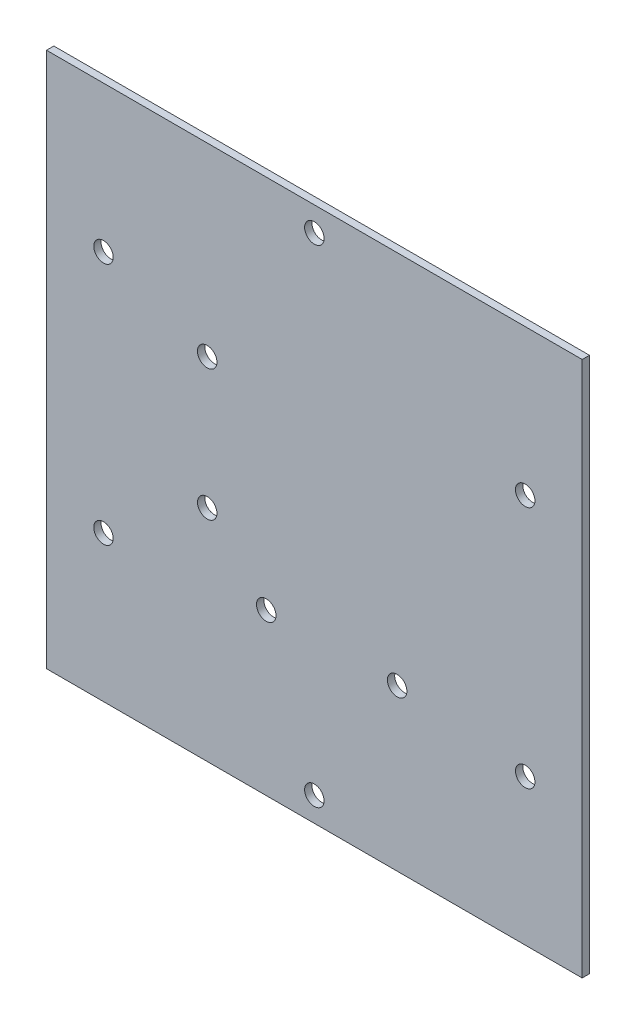
ISO-10303-21;
HEADER;
FILE_DESCRIPTION(('STEP AP214'),'2;1');
FILE_NAME('part.step','',(''),(''),'','','');
FILE_SCHEMA(('AUTOMOTIVE_DESIGN { 1 0 10303 214 1 1 1 1 }'));
ENDSEC;
DATA;
#1=APPLICATION_CONTEXT('core data for automotive mechanical design processes');
#2=APPLICATION_PROTOCOL_DEFINITION('international standard','automotive_design',2000,#1);
#3=PRODUCT_CONTEXT('',#1,'mechanical');
#4=PRODUCT('Part','Part','',(#3));
#5=PRODUCT_RELATED_PRODUCT_CATEGORY('part','',(#4));
#6=PRODUCT_DEFINITION_FORMATION('','',#4);
#7=PRODUCT_DEFINITION_CONTEXT('part definition',#1,'design');
#8=PRODUCT_DEFINITION('design','',#6,#7);
#9=PRODUCT_DEFINITION_SHAPE('','',#8);
#10=(LENGTH_UNIT() NAMED_UNIT(*) SI_UNIT(.MILLI.,.METRE.));
#11=(NAMED_UNIT(*) PLANE_ANGLE_UNIT() SI_UNIT($,.RADIAN.));
#12=(NAMED_UNIT(*) SI_UNIT($,.STERADIAN.) SOLID_ANGLE_UNIT());
#13=UNCERTAINTY_MEASURE_WITH_UNIT(LENGTH_MEASURE(1.E-05),#10,'distance_accuracy_value','');
#14=(GEOMETRIC_REPRESENTATION_CONTEXT(3) GLOBAL_UNCERTAINTY_ASSIGNED_CONTEXT((#13)) GLOBAL_UNIT_ASSIGNED_CONTEXT((#10,
#11,#12)) REPRESENTATION_CONTEXT('',''));
#15=CARTESIAN_POINT('',(0.,0.,0.));
#16=DIRECTION('',(0.,0.,1.));
#17=DIRECTION('',(1.,0.,0.));
#18=AXIS2_PLACEMENT_3D('',#15,#16,#17);
#19=CARTESIAN_POINT('',(-110.,110.,-3.));
#20=DIRECTION('',(-1.,0.,0.));
#21=DIRECTION('',(0.,0.,1.));
#22=AXIS2_PLACEMENT_3D('',#19,#20,#21);
#23=PLANE('',#22);
#24=DIRECTION('',(0.,-1.,0.));
#25=VECTOR('',#24,1.);
#26=CARTESIAN_POINT('',(-110.,110.,0.));
#27=LINE('',#26,#25);
#28=CARTESIAN_POINT('',(-110.,110.,0.));
#29=VERTEX_POINT('',#28);
#30=CARTESIAN_POINT('',(-110.,-110.,0.));
#31=VERTEX_POINT('',#30);
#32=EDGE_CURVE('E102',#29,#31,#27,.T.);
#33=ORIENTED_EDGE('',*,*,#32,.F.);
#34=DIRECTION('',(0.,0.,1.));
#35=VECTOR('',#34,1.);
#36=CARTESIAN_POINT('',(-110.,110.,-3.));
#37=LINE('',#36,#35);
#38=CARTESIAN_POINT('',(-110.,110.,-3.));
#39=VERTEX_POINT('',#38);
#40=EDGE_CURVE('E11',#39,#29,#37,.T.);
#41=ORIENTED_EDGE('',*,*,#40,.F.);
#42=DIRECTION('',(0.,-1.,0.));
#43=VECTOR('',#42,1.);
#44=CARTESIAN_POINT('',(-110.,110.,-3.));
#45=LINE('',#44,#43);
#46=CARTESIAN_POINT('',(-110.,-110.,-3.));
#47=VERTEX_POINT('',#46);
#48=EDGE_CURVE('E95',#39,#47,#45,.T.);
#49=ORIENTED_EDGE('',*,*,#48,.T.);
#50=DIRECTION('',(0.,0.,1.));
#51=VECTOR('',#50,1.);
#52=CARTESIAN_POINT('',(-110.,-110.,-3.));
#53=LINE('',#52,#51);
#54=EDGE_CURVE('E40',#47,#31,#53,.T.);
#55=ORIENTED_EDGE('',*,*,#54,.T.);
#56=EDGE_LOOP('',(#33,#41,#49,#55));
#57=FACE_BOUND('',#56,.T.);
#58=ADVANCED_FACE('F37',(#57),#23,.T.);
#59=CARTESIAN_POINT('',(-110.,110.,-3.));
#60=DIRECTION('',(0.,1.,0.));
#61=DIRECTION('',(0.,0.,1.));
#62=AXIS2_PLACEMENT_3D('',#59,#60,#61);
#63=PLANE('',#62);
#64=DIRECTION('',(-1.,0.,0.));
#65=VECTOR('',#64,1.);
#66=CARTESIAN_POINT('',(-110.,110.,0.));
#67=LINE('',#66,#65);
#68=CARTESIAN_POINT('',(110.,110.,0.));
#69=VERTEX_POINT('',#68);
#70=EDGE_CURVE('E97',#69,#29,#67,.T.);
#71=ORIENTED_EDGE('',*,*,#70,.F.);
#72=DIRECTION('',(0.,0.,1.));
#73=VECTOR('',#72,1.);
#74=CARTESIAN_POINT('',(110.,110.,-3.));
#75=LINE('',#74,#73);
#76=CARTESIAN_POINT('',(110.,110.,-3.));
#77=VERTEX_POINT('',#76);
#78=EDGE_CURVE('E46',#77,#69,#75,.T.);
#79=ORIENTED_EDGE('',*,*,#78,.F.);
#80=DIRECTION('',(-1.,0.,0.));
#81=VECTOR('',#80,1.);
#82=CARTESIAN_POINT('',(-110.,110.,-3.));
#83=LINE('',#82,#81);
#84=EDGE_CURVE('E92',#77,#39,#83,.T.);
#85=ORIENTED_EDGE('',*,*,#84,.T.);
#86=ORIENTED_EDGE('',*,*,#40,.T.);
#87=EDGE_LOOP('',(#71,#79,#85,#86));
#88=FACE_BOUND('',#87,.T.);
#89=ADVANCED_FACE('F113',(#88),#63,.T.);
#90=CARTESIAN_POINT('',(110.,110.,-3.));
#91=DIRECTION('',(1.,0.,0.));
#92=DIRECTION('',(0.,0.,-1.));
#93=AXIS2_PLACEMENT_3D('',#90,#91,#92);
#94=PLANE('',#93);
#95=DIRECTION('',(0.,1.,0.));
#96=VECTOR('',#95,1.);
#97=CARTESIAN_POINT('',(110.,110.,0.));
#98=LINE('',#97,#96);
#99=CARTESIAN_POINT('',(110.,-110.,0.));
#100=VERTEX_POINT('',#99);
#101=EDGE_CURVE('E87',#100,#69,#98,.T.);
#102=ORIENTED_EDGE('',*,*,#101,.F.);
#103=DIRECTION('',(0.,0.,1.));
#104=VECTOR('',#103,1.);
#105=CARTESIAN_POINT('',(110.,-110.,-3.));
#106=LINE('',#105,#104);
#107=CARTESIAN_POINT('',(110.,-110.,-3.));
#108=VERTEX_POINT('',#107);
#109=EDGE_CURVE('E82',#108,#100,#106,.T.);
#110=ORIENTED_EDGE('',*,*,#109,.F.);
#111=DIRECTION('',(0.,1.,0.));
#112=VECTOR('',#111,1.);
#113=CARTESIAN_POINT('',(110.,110.,-3.));
#114=LINE('',#113,#112);
#115=EDGE_CURVE('E85',#108,#77,#114,.T.);
#116=ORIENTED_EDGE('',*,*,#115,.T.);
#117=ORIENTED_EDGE('',*,*,#78,.T.);
#118=EDGE_LOOP('',(#102,#110,#116,#117));
#119=FACE_BOUND('',#118,.T.);
#120=ADVANCED_FACE('F84',(#119),#94,.T.);
#121=CARTESIAN_POINT('',(-110.,-110.,-3.));
#122=DIRECTION('',(0.,-1.,0.));
#123=DIRECTION('',(0.,0.,-1.));
#124=AXIS2_PLACEMENT_3D('',#121,#122,#123);
#125=PLANE('',#124);
#126=DIRECTION('',(1.,0.,0.));
#127=VECTOR('',#126,1.);
#128=CARTESIAN_POINT('',(-110.,-110.,0.));
#129=LINE('',#128,#127);
#130=EDGE_CURVE('E105',#31,#100,#129,.T.);
#131=ORIENTED_EDGE('',*,*,#130,.F.);
#132=ORIENTED_EDGE('',*,*,#54,.F.);
#133=DIRECTION('',(1.,0.,0.));
#134=VECTOR('',#133,1.);
#135=CARTESIAN_POINT('',(-110.,-110.,-3.));
#136=LINE('',#135,#134);
#137=EDGE_CURVE('E91',#47,#108,#136,.T.);
#138=ORIENTED_EDGE('',*,*,#137,.T.);
#139=ORIENTED_EDGE('',*,*,#109,.T.);
#140=EDGE_LOOP('',(#131,#132,#138,#139));
#141=FACE_BOUND('',#140,.T.);
#142=ADVANCED_FACE('F94',(#141),#125,.T.);
#143=CARTESIAN_POINT('',(0.,0.,-3.));
#144=DIRECTION('',(0.,0.,1.));
#145=DIRECTION('',(1.,0.,0.));
#146=AXIS2_PLACEMENT_3D('',#143,#144,#145);
#147=PLANE('',#146);
#148=CARTESIAN_POINT('',(-44.,34.,-3.));
#149=DIRECTION('',(0.,0.,1.));
#150=DIRECTION('',(1.,0.,0.));
#151=AXIS2_PLACEMENT_3D('',#148,#149,#150);
#152=CIRCLE('',#151,4.00000000000001);
#153=CARTESIAN_POINT('',(-40.,34.,-3.));
#154=VERTEX_POINT('',#153);
#155=EDGE_CURVE('E188',#154,#154,#152,.T.);
#156=ORIENTED_EDGE('',*,*,#155,.T.);
#157=EDGE_LOOP('',(#156));
#158=FACE_BOUND('',#157,.T.);
#159=CARTESIAN_POINT('',(34.,-44.,-3.));
#160=DIRECTION('',(0.,0.,1.));
#161=DIRECTION('',(1.,0.,0.));
#162=AXIS2_PLACEMENT_3D('',#159,#160,#161);
#163=CIRCLE('',#162,4.00000000000001);
#164=CARTESIAN_POINT('',(38.,-44.,-3.));
#165=VERTEX_POINT('',#164);
#166=EDGE_CURVE('E194',#165,#165,#163,.T.);
#167=ORIENTED_EDGE('',*,*,#166,.T.);
#168=EDGE_LOOP('',(#167));
#169=FACE_BOUND('',#168,.T.);
#170=CARTESIAN_POINT('',(-44.,-19.75,-3.));
#171=DIRECTION('',(0.,0.,1.));
#172=DIRECTION('',(1.,0.,0.));
#173=AXIS2_PLACEMENT_3D('',#170,#171,#172);
#174=CIRCLE('',#173,4.00000000000001);
#175=CARTESIAN_POINT('',(-40.,-19.75,-3.));
#176=VERTEX_POINT('',#175);
#177=EDGE_CURVE('E179',#176,#176,#174,.T.);
#178=ORIENTED_EDGE('',*,*,#177,.T.);
#179=EDGE_LOOP('',(#178));
#180=FACE_BOUND('',#179,.T.);
#181=CARTESIAN_POINT('',(-19.75,-44.,-3.));
#182=DIRECTION('',(0.,0.,1.));
#183=DIRECTION('',(1.,0.,0.));
#184=AXIS2_PLACEMENT_3D('',#181,#182,#183);
#185=CIRCLE('',#184,4.);
#186=CARTESIAN_POINT('',(-15.75,-44.,-3.));
#187=VERTEX_POINT('',#186);
#188=EDGE_CURVE('E199',#187,#187,#185,.T.);
#189=ORIENTED_EDGE('',*,*,#188,.T.);
#190=EDGE_LOOP('',(#189));
#191=FACE_BOUND('',#190,.T.);
#192=CARTESIAN_POINT('',(-86.6025403784439,50.,-3.));
#193=DIRECTION('',(0.,0.,1.));
#194=DIRECTION('',(1.,0.,0.));
#195=AXIS2_PLACEMENT_3D('',#192,#193,#194);
#196=CIRCLE('',#195,4.00000000000118);
#197=CARTESIAN_POINT('',(-82.6025403784428,50.,-3.));
#198=VERTEX_POINT('',#197);
#199=EDGE_CURVE('E205',#198,#198,#196,.T.);
#200=ORIENTED_EDGE('',*,*,#199,.T.);
#201=EDGE_LOOP('',(#200));
#202=FACE_BOUND('',#201,.T.);
#203=CARTESIAN_POINT('',(-86.6025403784443,-49.9999999999992,-3.));
#204=DIRECTION('',(0.,0.,1.));
#205=DIRECTION('',(1.,0.,0.));
#206=AXIS2_PLACEMENT_3D('',#203,#204,#205);
#207=CIRCLE('',#206,4.);
#208=CARTESIAN_POINT('',(-82.6025403784443,-49.9999999999992,-3.));
#209=VERTEX_POINT('',#208);
#210=EDGE_CURVE('E211',#209,#209,#207,.T.);
#211=ORIENTED_EDGE('',*,*,#210,.T.);
#212=EDGE_LOOP('',(#211));
#213=FACE_BOUND('',#212,.T.);
#214=CARTESIAN_POINT('',(-6.91357373864719E-13,-100.,-3.));
#215=DIRECTION('',(0.,0.,1.));
#216=DIRECTION('',(1.,0.,0.));
#217=AXIS2_PLACEMENT_3D('',#214,#215,#216);
#218=CIRCLE('',#217,4.00000000000001);
#219=CARTESIAN_POINT('',(3.99999999999932,-100.,-3.));
#220=VERTEX_POINT('',#219);
#221=EDGE_CURVE('E217',#220,#220,#218,.T.);
#222=ORIENTED_EDGE('',*,*,#221,.T.);
#223=EDGE_LOOP('',(#222));
#224=FACE_BOUND('',#223,.T.);
#225=CARTESIAN_POINT('',(86.6025403784436,-50.0000000000004,-3.));
#226=DIRECTION('',(0.,0.,1.));
#227=DIRECTION('',(1.,0.,0.));
#228=AXIS2_PLACEMENT_3D('',#225,#226,#227);
#229=CIRCLE('',#228,4.00000000000001);
#230=CARTESIAN_POINT('',(90.6025403784436,-50.0000000000004,-3.));
#231=VERTEX_POINT('',#230);
#232=EDGE_CURVE('E223',#231,#231,#229,.T.);
#233=ORIENTED_EDGE('',*,*,#232,.T.);
#234=EDGE_LOOP('',(#233));
#235=FACE_BOUND('',#234,.T.);
#236=CARTESIAN_POINT('',(86.6025403784439,50.,-3.));
#237=DIRECTION('',(0.,0.,1.));
#238=DIRECTION('',(1.,0.,0.));
#239=AXIS2_PLACEMENT_3D('',#236,#237,#238);
#240=CIRCLE('',#239,4.00000000000025);
#241=CARTESIAN_POINT('',(90.6025403784441,50.,-3.));
#242=VERTEX_POINT('',#241);
#243=EDGE_CURVE('E229',#242,#242,#240,.T.);
#244=ORIENTED_EDGE('',*,*,#243,.T.);
#245=EDGE_LOOP('',(#244));
#246=FACE_BOUND('',#245,.T.);
#247=CARTESIAN_POINT('',(0.,100.,-3.));
#248=DIRECTION('',(0.,0.,1.));
#249=DIRECTION('',(1.,0.,0.));
#250=AXIS2_PLACEMENT_3D('',#247,#248,#249);
#251=CIRCLE('',#250,3.99999999999999);
#252=CARTESIAN_POINT('',(3.99999999999999,100.,-3.));
#253=VERTEX_POINT('',#252);
#254=EDGE_CURVE('E106',#253,#253,#251,.T.);
#255=ORIENTED_EDGE('',*,*,#254,.T.);
#256=EDGE_LOOP('',(#255));
#257=FACE_BOUND('',#256,.T.);
#258=ORIENTED_EDGE('',*,*,#48,.F.);
#259=ORIENTED_EDGE('',*,*,#84,.F.);
#260=ORIENTED_EDGE('',*,*,#115,.F.);
#261=ORIENTED_EDGE('',*,*,#137,.F.);
#262=EDGE_LOOP('',(#258,#259,#260,#261));
#263=FACE_BOUND('',#262,.T.);
#264=ADVANCED_FACE('F90',(#158,#169,#180,#191,#202,#213,#224,#235,#246,#257,#263),#147,.F.);
#265=CARTESIAN_POINT('',(0.,0.,0.));
#266=DIRECTION('',(0.,0.,1.));
#267=DIRECTION('',(1.,0.,0.));
#268=AXIS2_PLACEMENT_3D('',#265,#266,#267);
#269=PLANE('',#268);
#270=CARTESIAN_POINT('',(-44.,34.,0.));
#271=DIRECTION('',(0.,0.,1.));
#272=DIRECTION('',(1.,0.,0.));
#273=AXIS2_PLACEMENT_3D('',#270,#271,#272);
#274=CIRCLE('',#273,4.00000000000001);
#275=CARTESIAN_POINT('',(-40.,34.,0.));
#276=VERTEX_POINT('',#275);
#277=EDGE_CURVE('E191',#276,#276,#274,.T.);
#278=ORIENTED_EDGE('',*,*,#277,.F.);
#279=EDGE_LOOP('',(#278));
#280=FACE_BOUND('',#279,.T.);
#281=CARTESIAN_POINT('',(34.,-44.,0.));
#282=DIRECTION('',(0.,0.,1.));
#283=DIRECTION('',(1.,0.,0.));
#284=AXIS2_PLACEMENT_3D('',#281,#282,#283);
#285=CIRCLE('',#284,4.00000000000001);
#286=CARTESIAN_POINT('',(38.,-44.,0.));
#287=VERTEX_POINT('',#286);
#288=EDGE_CURVE('E185',#287,#287,#285,.T.);
#289=ORIENTED_EDGE('',*,*,#288,.F.);
#290=EDGE_LOOP('',(#289));
#291=FACE_BOUND('',#290,.T.);
#292=CARTESIAN_POINT('',(-44.,-19.75,0.));
#293=DIRECTION('',(0.,0.,1.));
#294=DIRECTION('',(1.,0.,0.));
#295=AXIS2_PLACEMENT_3D('',#292,#293,#294);
#296=CIRCLE('',#295,4.00000000000001);
#297=CARTESIAN_POINT('',(-40.,-19.75,0.));
#298=VERTEX_POINT('',#297);
#299=EDGE_CURVE('E182',#298,#298,#296,.T.);
#300=ORIENTED_EDGE('',*,*,#299,.F.);
#301=EDGE_LOOP('',(#300));
#302=FACE_BOUND('',#301,.T.);
#303=CARTESIAN_POINT('',(-19.75,-44.,0.));
#304=DIRECTION('',(0.,0.,1.));
#305=DIRECTION('',(1.,0.,0.));
#306=AXIS2_PLACEMENT_3D('',#303,#304,#305);
#307=CIRCLE('',#306,4.);
#308=CARTESIAN_POINT('',(-15.75,-44.,0.));
#309=VERTEX_POINT('',#308);
#310=EDGE_CURVE('E190',#309,#309,#307,.T.);
#311=ORIENTED_EDGE('',*,*,#310,.F.);
#312=EDGE_LOOP('',(#311));
#313=FACE_BOUND('',#312,.T.);
#314=CARTESIAN_POINT('',(-86.6025403784439,50.,0.));
#315=DIRECTION('',(0.,0.,1.));
#316=DIRECTION('',(1.,0.,0.));
#317=AXIS2_PLACEMENT_3D('',#314,#315,#316);
#318=CIRCLE('',#317,4.00000000000118);
#319=CARTESIAN_POINT('',(-82.6025403784428,50.,0.));
#320=VERTEX_POINT('',#319);
#321=EDGE_CURVE('E202',#320,#320,#318,.T.);
#322=ORIENTED_EDGE('',*,*,#321,.F.);
#323=EDGE_LOOP('',(#322));
#324=FACE_BOUND('',#323,.T.);
#325=CARTESIAN_POINT('',(-86.6025403784443,-49.9999999999992,0.));
#326=DIRECTION('',(0.,0.,1.));
#327=DIRECTION('',(1.,0.,0.));
#328=AXIS2_PLACEMENT_3D('',#325,#326,#327);
#329=CIRCLE('',#328,4.);
#330=CARTESIAN_POINT('',(-82.6025403784443,-49.9999999999992,0.));
#331=VERTEX_POINT('',#330);
#332=EDGE_CURVE('E208',#331,#331,#329,.T.);
#333=ORIENTED_EDGE('',*,*,#332,.F.);
#334=EDGE_LOOP('',(#333));
#335=FACE_BOUND('',#334,.T.);
#336=CARTESIAN_POINT('',(-6.91357373864719E-13,-100.,0.));
#337=DIRECTION('',(0.,0.,1.));
#338=DIRECTION('',(1.,0.,0.));
#339=AXIS2_PLACEMENT_3D('',#336,#337,#338);
#340=CIRCLE('',#339,4.00000000000001);
#341=CARTESIAN_POINT('',(3.99999999999932,-100.,0.));
#342=VERTEX_POINT('',#341);
#343=EDGE_CURVE('E214',#342,#342,#340,.T.);
#344=ORIENTED_EDGE('',*,*,#343,.F.);
#345=EDGE_LOOP('',(#344));
#346=FACE_BOUND('',#345,.T.);
#347=CARTESIAN_POINT('',(86.6025403784436,-50.0000000000004,0.));
#348=DIRECTION('',(0.,0.,1.));
#349=DIRECTION('',(1.,0.,0.));
#350=AXIS2_PLACEMENT_3D('',#347,#348,#349);
#351=CIRCLE('',#350,4.00000000000001);
#352=CARTESIAN_POINT('',(90.6025403784436,-50.0000000000004,0.));
#353=VERTEX_POINT('',#352);
#354=EDGE_CURVE('E220',#353,#353,#351,.T.);
#355=ORIENTED_EDGE('',*,*,#354,.F.);
#356=EDGE_LOOP('',(#355));
#357=FACE_BOUND('',#356,.T.);
#358=CARTESIAN_POINT('',(86.6025403784439,50.,0.));
#359=DIRECTION('',(0.,0.,1.));
#360=DIRECTION('',(1.,0.,0.));
#361=AXIS2_PLACEMENT_3D('',#358,#359,#360);
#362=CIRCLE('',#361,4.00000000000025);
#363=CARTESIAN_POINT('',(90.6025403784441,50.,0.));
#364=VERTEX_POINT('',#363);
#365=EDGE_CURVE('E226',#364,#364,#362,.T.);
#366=ORIENTED_EDGE('',*,*,#365,.F.);
#367=EDGE_LOOP('',(#366));
#368=FACE_BOUND('',#367,.T.);
#369=CARTESIAN_POINT('',(0.,100.,0.));
#370=DIRECTION('',(0.,0.,1.));
#371=DIRECTION('',(1.,0.,0.));
#372=AXIS2_PLACEMENT_3D('',#369,#370,#371);
#373=CIRCLE('',#372,3.99999999999999);
#374=CARTESIAN_POINT('',(3.99999999999999,100.,0.));
#375=VERTEX_POINT('',#374);
#376=EDGE_CURVE('E232',#375,#375,#373,.T.);
#377=ORIENTED_EDGE('',*,*,#376,.F.);
#378=EDGE_LOOP('',(#377));
#379=FACE_BOUND('',#378,.T.);
#380=ORIENTED_EDGE('',*,*,#32,.T.);
#381=ORIENTED_EDGE('',*,*,#130,.T.);
#382=ORIENTED_EDGE('',*,*,#101,.T.);
#383=ORIENTED_EDGE('',*,*,#70,.T.);
#384=EDGE_LOOP('',(#380,#381,#382,#383));
#385=FACE_BOUND('',#384,.T.);
#386=ADVANCED_FACE('F112',(#280,#291,#302,#313,#324,#335,#346,#357,#368,#379,#385),#269,.T.);
#387=CARTESIAN_POINT('',(0.,100.,-3.));
#388=DIRECTION('',(0.,0.,1.));
#389=DIRECTION('',(1.,0.,0.));
#390=AXIS2_PLACEMENT_3D('',#387,#388,#389);
#391=CYLINDRICAL_SURFACE('',#390,3.99999999999999);
#392=ORIENTED_EDGE('',*,*,#254,.F.);
#393=EDGE_LOOP('',(#392));
#394=FACE_BOUND('',#393,.T.);
#395=ORIENTED_EDGE('',*,*,#376,.T.);
#396=EDGE_LOOP('',(#395));
#397=FACE_BOUND('',#396,.T.);
#398=ADVANCED_FACE('F131',(#394,#397),#391,.F.);
#399=CARTESIAN_POINT('',(86.6025403784439,50.,-3.));
#400=DIRECTION('',(0.,0.,1.));
#401=DIRECTION('',(1.,0.,0.));
#402=AXIS2_PLACEMENT_3D('',#399,#400,#401);
#403=CYLINDRICAL_SURFACE('',#402,4.00000000000025);
#404=ORIENTED_EDGE('',*,*,#243,.F.);
#405=EDGE_LOOP('',(#404));
#406=FACE_BOUND('',#405,.T.);
#407=ORIENTED_EDGE('',*,*,#365,.T.);
#408=EDGE_LOOP('',(#407));
#409=FACE_BOUND('',#408,.T.);
#410=ADVANCED_FACE('F138',(#406,#409),#403,.F.);
#411=CARTESIAN_POINT('',(86.6025403784436,-50.0000000000004,-3.));
#412=DIRECTION('',(0.,0.,1.));
#413=DIRECTION('',(1.,0.,0.));
#414=AXIS2_PLACEMENT_3D('',#411,#412,#413);
#415=CYLINDRICAL_SURFACE('',#414,4.00000000000001);
#416=ORIENTED_EDGE('',*,*,#232,.F.);
#417=EDGE_LOOP('',(#416));
#418=FACE_BOUND('',#417,.T.);
#419=ORIENTED_EDGE('',*,*,#354,.T.);
#420=EDGE_LOOP('',(#419));
#421=FACE_BOUND('',#420,.T.);
#422=ADVANCED_FACE('F142',(#418,#421),#415,.F.);
#423=CARTESIAN_POINT('',(-6.91357373864719E-13,-100.,-3.));
#424=DIRECTION('',(0.,0.,1.));
#425=DIRECTION('',(1.,0.,0.));
#426=AXIS2_PLACEMENT_3D('',#423,#424,#425);
#427=CYLINDRICAL_SURFACE('',#426,4.00000000000001);
#428=ORIENTED_EDGE('',*,*,#221,.F.);
#429=EDGE_LOOP('',(#428));
#430=FACE_BOUND('',#429,.T.);
#431=ORIENTED_EDGE('',*,*,#343,.T.);
#432=EDGE_LOOP('',(#431));
#433=FACE_BOUND('',#432,.T.);
#434=ADVANCED_FACE('F146',(#430,#433),#427,.F.);
#435=CARTESIAN_POINT('',(-86.6025403784443,-49.9999999999992,-3.));
#436=DIRECTION('',(0.,0.,1.));
#437=DIRECTION('',(1.,0.,0.));
#438=AXIS2_PLACEMENT_3D('',#435,#436,#437);
#439=CYLINDRICAL_SURFACE('',#438,4.);
#440=ORIENTED_EDGE('',*,*,#210,.F.);
#441=EDGE_LOOP('',(#440));
#442=FACE_BOUND('',#441,.T.);
#443=ORIENTED_EDGE('',*,*,#332,.T.);
#444=EDGE_LOOP('',(#443));
#445=FACE_BOUND('',#444,.T.);
#446=ADVANCED_FACE('F150',(#442,#445),#439,.F.);
#447=CARTESIAN_POINT('',(-86.6025403784439,50.,-3.));
#448=DIRECTION('',(0.,0.,1.));
#449=DIRECTION('',(1.,0.,0.));
#450=AXIS2_PLACEMENT_3D('',#447,#448,#449);
#451=CYLINDRICAL_SURFACE('',#450,4.00000000000118);
#452=ORIENTED_EDGE('',*,*,#199,.F.);
#453=EDGE_LOOP('',(#452));
#454=FACE_BOUND('',#453,.T.);
#455=ORIENTED_EDGE('',*,*,#321,.T.);
#456=EDGE_LOOP('',(#455));
#457=FACE_BOUND('',#456,.T.);
#458=ADVANCED_FACE('F154',(#454,#457),#451,.F.);
#459=CARTESIAN_POINT('',(-19.75,-44.,-3.));
#460=DIRECTION('',(0.,0.,1.));
#461=DIRECTION('',(1.,0.,0.));
#462=AXIS2_PLACEMENT_3D('',#459,#460,#461);
#463=CYLINDRICAL_SURFACE('',#462,4.);
#464=ORIENTED_EDGE('',*,*,#188,.F.);
#465=EDGE_LOOP('',(#464));
#466=FACE_BOUND('',#465,.T.);
#467=ORIENTED_EDGE('',*,*,#310,.T.);
#468=EDGE_LOOP('',(#467));
#469=FACE_BOUND('',#468,.T.);
#470=ADVANCED_FACE('F158',(#466,#469),#463,.F.);
#471=CARTESIAN_POINT('',(-44.,-19.75,-3.));
#472=DIRECTION('',(0.,0.,1.));
#473=DIRECTION('',(1.,0.,0.));
#474=AXIS2_PLACEMENT_3D('',#471,#472,#473);
#475=CYLINDRICAL_SURFACE('',#474,4.00000000000001);
#476=ORIENTED_EDGE('',*,*,#177,.F.);
#477=EDGE_LOOP('',(#476));
#478=FACE_BOUND('',#477,.T.);
#479=ORIENTED_EDGE('',*,*,#299,.T.);
#480=EDGE_LOOP('',(#479));
#481=FACE_BOUND('',#480,.T.);
#482=ADVANCED_FACE('F162',(#478,#481),#475,.F.);
#483=CARTESIAN_POINT('',(34.,-44.,-3.));
#484=DIRECTION('',(0.,0.,1.));
#485=DIRECTION('',(1.,0.,0.));
#486=AXIS2_PLACEMENT_3D('',#483,#484,#485);
#487=CYLINDRICAL_SURFACE('',#486,4.00000000000001);
#488=ORIENTED_EDGE('',*,*,#166,.F.);
#489=EDGE_LOOP('',(#488));
#490=FACE_BOUND('',#489,.T.);
#491=ORIENTED_EDGE('',*,*,#288,.T.);
#492=EDGE_LOOP('',(#491));
#493=FACE_BOUND('',#492,.T.);
#494=ADVANCED_FACE('F164',(#490,#493),#487,.F.);
#495=CARTESIAN_POINT('',(-44.,34.,-3.));
#496=DIRECTION('',(0.,0.,1.));
#497=DIRECTION('',(1.,0.,0.));
#498=AXIS2_PLACEMENT_3D('',#495,#496,#497);
#499=CYLINDRICAL_SURFACE('',#498,4.00000000000001);
#500=ORIENTED_EDGE('',*,*,#155,.F.);
#501=EDGE_LOOP('',(#500));
#502=FACE_BOUND('',#501,.T.);
#503=ORIENTED_EDGE('',*,*,#277,.T.);
#504=EDGE_LOOP('',(#503));
#505=FACE_BOUND('',#504,.T.);
#506=ADVANCED_FACE('F167',(#502,#505),#499,.F.);
#507=CLOSED_SHELL('',(#58,#89,#120,#142,#264,#386,#398,#410,#422,#434,#446,#458,#470,#482,#494,#506));
#508=MANIFOLD_SOLID_BREP('B2',#507);
#509=ADVANCED_BREP_SHAPE_REPRESENTATION('',(#18,#508),#14);
#510=SHAPE_DEFINITION_REPRESENTATION(#9,#509);
ENDSEC;
END-ISO-10303-21;
